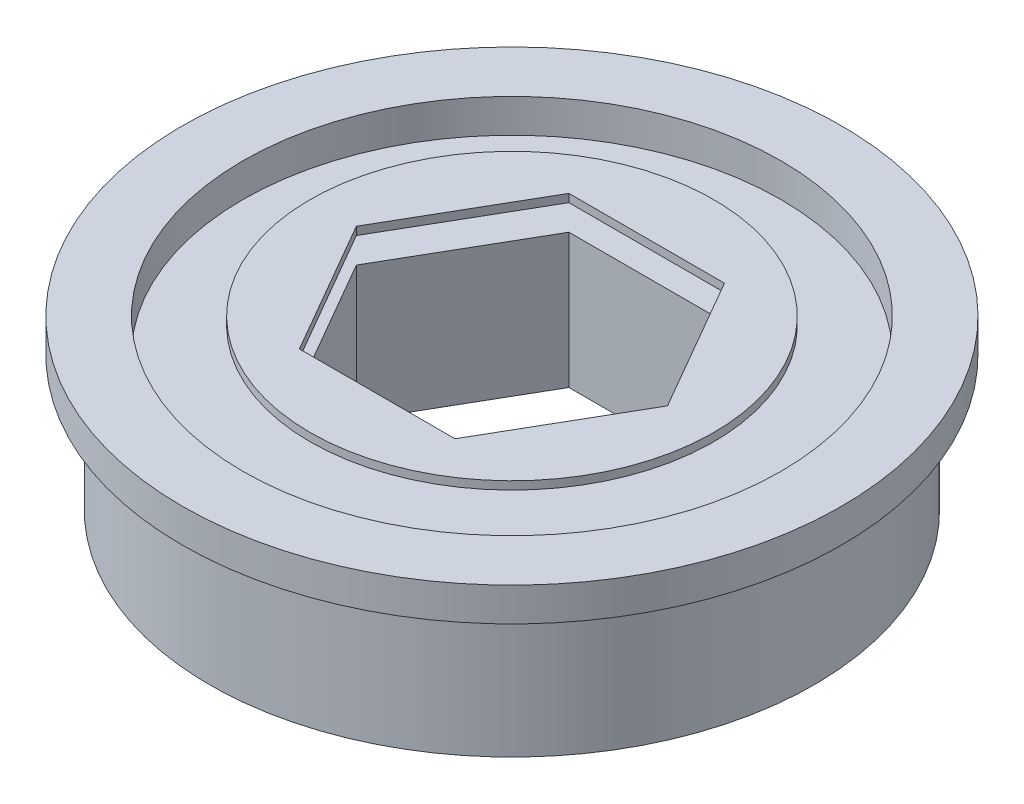
ISO-10303-21;
HEADER;
FILE_DESCRIPTION(('STEP AP214'),'2;1');
FILE_NAME('part.step','',(''),(''),'','','');
FILE_SCHEMA(('AUTOMOTIVE_DESIGN { 1 0 10303 214 1 1 1 1 }'));
ENDSEC;
DATA;
#1=APPLICATION_CONTEXT('core data for automotive mechanical design processes');
#2=APPLICATION_PROTOCOL_DEFINITION('international standard','automotive_design',2000,#1);
#3=PRODUCT_CONTEXT('',#1,'mechanical');
#4=PRODUCT('Part','Part','',(#3));
#5=PRODUCT_RELATED_PRODUCT_CATEGORY('part','',(#4));
#6=PRODUCT_DEFINITION_FORMATION('','',#4);
#7=PRODUCT_DEFINITION_CONTEXT('part definition',#1,'design');
#8=PRODUCT_DEFINITION('design','',#6,#7);
#9=PRODUCT_DEFINITION_SHAPE('','',#8);
#10=(LENGTH_UNIT() NAMED_UNIT(*) SI_UNIT(.MILLI.,.METRE.));
#11=(NAMED_UNIT(*) PLANE_ANGLE_UNIT() SI_UNIT($,.RADIAN.));
#12=(NAMED_UNIT(*) SI_UNIT($,.STERADIAN.) SOLID_ANGLE_UNIT());
#13=UNCERTAINTY_MEASURE_WITH_UNIT(LENGTH_MEASURE(1.E-05),#10,'distance_accuracy_value','');
#14=(GEOMETRIC_REPRESENTATION_CONTEXT(3) GLOBAL_UNCERTAINTY_ASSIGNED_CONTEXT((#13)) GLOBAL_UNIT_ASSIGNED_CONTEXT((#10,
#11,#12)) REPRESENTATION_CONTEXT('',''));
#15=CARTESIAN_POINT('',(0.,0.,0.));
#16=DIRECTION('',(0.,0.,1.));
#17=DIRECTION('',(1.,0.,0.));
#18=AXIS2_PLACEMENT_3D('',#15,#16,#17);
#19=CARTESIAN_POINT('',(0.,7.9375,0.));
#20=DIRECTION('',(0.,-1.,0.));
#21=DIRECTION('',(0.,0.,-1.));
#22=AXIS2_PLACEMENT_3D('',#19,#20,#21);
#23=CYLINDRICAL_SURFACE('',#22,9.525);
#24=CARTESIAN_POINT('',(0.,7.9375,0.));
#25=DIRECTION('',(0.,-1.,0.));
#26=DIRECTION('',(0.,0.,1.));
#27=AXIS2_PLACEMENT_3D('',#24,#25,#26);
#28=CIRCLE('',#27,9.525);
#29=CARTESIAN_POINT('',(0.,7.9375,9.525));
#30=VERTEX_POINT('',#29);
#31=EDGE_CURVE('E136',#30,#30,#28,.T.);
#32=ORIENTED_EDGE('',*,*,#31,.T.);
#33=EDGE_LOOP('',(#32));
#34=FACE_BOUND('',#33,.T.);
#35=CARTESIAN_POINT('',(0.,7.5565,0.));
#36=DIRECTION('',(0.,-1.,0.));
#37=DIRECTION('',(0.,0.,1.));
#38=AXIS2_PLACEMENT_3D('',#35,#36,#37);
#39=CIRCLE('',#38,9.525);
#40=CARTESIAN_POINT('',(0.,7.5565,9.525));
#41=VERTEX_POINT('',#40);
#42=EDGE_CURVE('E125',#41,#41,#39,.T.);
#43=ORIENTED_EDGE('',*,*,#42,.F.);
#44=EDGE_LOOP('',(#43));
#45=FACE_BOUND('',#44,.T.);
#46=ADVANCED_FACE('F44',(#34,#45),#23,.T.);
#47=CARTESIAN_POINT('',(0.,7.9375,0.));
#48=DIRECTION('',(0.,1.,0.));
#49=DIRECTION('',(0.,0.,1.));
#50=AXIS2_PLACEMENT_3D('',#47,#48,#49);
#51=PLANE('',#50);
#52=DIRECTION('',(-1.,0.,0.));
#53=VECTOR('',#52,1.);
#54=CARTESIAN_POINT('',(3.67194771204602,7.9375,6.36));
#55=LINE('',#54,#53);
#56=CARTESIAN_POINT('',(3.67194771204602,7.9375,6.36));
#57=VERTEX_POINT('',#56);
#58=CARTESIAN_POINT('',(-3.67194771204601,7.9375,6.36));
#59=VERTEX_POINT('',#58);
#60=EDGE_CURVE('E99',#57,#59,#55,.T.);
#61=ORIENTED_EDGE('',*,*,#60,.T.);
#62=DIRECTION('',(-0.5,0.,-0.866025403784439));
#63=VECTOR('',#62,1.);
#64=CARTESIAN_POINT('',(-3.67194771204601,7.9375,6.36));
#65=LINE('',#64,#63);
#66=CARTESIAN_POINT('',(-7.34389542409204,7.9375,0.));
#67=VERTEX_POINT('',#66);
#68=EDGE_CURVE('E106',#59,#67,#65,.T.);
#69=ORIENTED_EDGE('',*,*,#68,.T.);
#70=DIRECTION('',(0.5,0.,-0.866025403784439));
#71=VECTOR('',#70,1.);
#72=CARTESIAN_POINT('',(-7.34389542409204,7.9375,0.));
#73=LINE('',#72,#71);
#74=CARTESIAN_POINT('',(-3.67194771204602,7.9375,-6.36));
#75=VERTEX_POINT('',#74);
#76=EDGE_CURVE('E58',#67,#75,#73,.T.);
#77=ORIENTED_EDGE('',*,*,#76,.T.);
#78=DIRECTION('',(1.,0.,0.));
#79=VECTOR('',#78,1.);
#80=CARTESIAN_POINT('',(-3.67194771204602,7.9375,-6.36));
#81=LINE('',#80,#79);
#82=CARTESIAN_POINT('',(3.67194771204602,7.9375,-6.36));
#83=VERTEX_POINT('',#82);
#84=EDGE_CURVE('E117',#75,#83,#81,.T.);
#85=ORIENTED_EDGE('',*,*,#84,.T.);
#86=DIRECTION('',(0.5,0.,0.866025403784438));
#87=VECTOR('',#86,1.);
#88=CARTESIAN_POINT('',(3.67194771204602,7.9375,-6.36));
#89=LINE('',#88,#87);
#90=CARTESIAN_POINT('',(7.34389542409204,7.9375,0.));
#91=VERTEX_POINT('',#90);
#92=EDGE_CURVE('E120',#83,#91,#89,.T.);
#93=ORIENTED_EDGE('',*,*,#92,.T.);
#94=DIRECTION('',(-0.5,0.,0.866025403784439));
#95=VECTOR('',#94,1.);
#96=CARTESIAN_POINT('',(7.34389542409204,7.9375,0.));
#97=LINE('',#96,#95);
#98=EDGE_CURVE('E103',#91,#57,#97,.T.);
#99=ORIENTED_EDGE('',*,*,#98,.T.);
#100=EDGE_LOOP('',(#61,#69,#77,#85,#93,#99));
#101=FACE_BOUND('',#100,.T.);
#102=ORIENTED_EDGE('',*,*,#31,.F.);
#103=EDGE_LOOP('',(#102));
#104=FACE_BOUND('',#103,.T.);
#105=ADVANCED_FACE('F110',(#101,#104),#51,.T.);
#106=CARTESIAN_POINT('',(0.,7.5565,0.));
#107=DIRECTION('',(0.,1.,0.));
#108=DIRECTION('',(0.,0.,1.));
#109=AXIS2_PLACEMENT_3D('',#106,#107,#108);
#110=PLANE('',#109);
#111=DIRECTION('',(0.5,0.,0.866025403784439));
#112=VECTOR('',#111,1.);
#113=CARTESIAN_POINT('',(-5.50792156806903,7.5565,3.18));
#114=LINE('',#113,#112);
#115=CARTESIAN_POINT('',(-7.34389542409204,7.5565,0.));
#116=VERTEX_POINT('',#115);
#117=CARTESIAN_POINT('',(-3.67194771204601,7.5565,6.36));
#118=VERTEX_POINT('',#117);
#119=EDGE_CURVE('E139',#116,#118,#114,.T.);
#120=ORIENTED_EDGE('',*,*,#119,.T.);
#121=DIRECTION('',(1.,0.,0.));
#122=VECTOR('',#121,1.);
#123=CARTESIAN_POINT('',(0.,7.5565,6.36));
#124=LINE('',#123,#122);
#125=CARTESIAN_POINT('',(3.67194771204602,7.5565,6.36));
#126=VERTEX_POINT('',#125);
#127=EDGE_CURVE('E12',#118,#126,#124,.T.);
#128=ORIENTED_EDGE('',*,*,#127,.T.);
#129=DIRECTION('',(0.5,0.,-0.866025403784439));
#130=VECTOR('',#129,1.);
#131=CARTESIAN_POINT('',(5.50792156806903,7.5565,3.18));
#132=LINE('',#131,#130);
#133=CARTESIAN_POINT('',(7.34389542409204,7.5565,0.));
#134=VERTEX_POINT('',#133);
#135=EDGE_CURVE('E51',#126,#134,#132,.T.);
#136=ORIENTED_EDGE('',*,*,#135,.T.);
#137=DIRECTION('',(-0.5,0.,-0.866025403784439));
#138=VECTOR('',#137,1.);
#139=CARTESIAN_POINT('',(5.50792156806903,7.5565,-3.18));
#140=LINE('',#139,#138);
#141=CARTESIAN_POINT('',(3.67194771204602,7.5565,-6.36));
#142=VERTEX_POINT('',#141);
#143=EDGE_CURVE('E149',#134,#142,#140,.T.);
#144=ORIENTED_EDGE('',*,*,#143,.T.);
#145=DIRECTION('',(-1.,0.,0.));
#146=VECTOR('',#145,1.);
#147=CARTESIAN_POINT('',(0.,7.5565,-6.36));
#148=LINE('',#147,#146);
#149=CARTESIAN_POINT('',(-3.67194771204602,7.5565,-6.36));
#150=VERTEX_POINT('',#149);
#151=EDGE_CURVE('E146',#142,#150,#148,.T.);
#152=ORIENTED_EDGE('',*,*,#151,.T.);
#153=DIRECTION('',(-0.5,0.,0.866025403784439));
#154=VECTOR('',#153,1.);
#155=CARTESIAN_POINT('',(-5.50792156806903,7.5565,-3.18));
#156=LINE('',#155,#154);
#157=EDGE_CURVE('E143',#150,#116,#156,.T.);
#158=ORIENTED_EDGE('',*,*,#157,.T.);
#159=EDGE_LOOP('',(#120,#128,#136,#144,#152,#158));
#160=FACE_BOUND('',#159,.T.);
#161=ORIENTED_EDGE('',*,*,#42,.T.);
#162=EDGE_LOOP('',(#161));
#163=FACE_BOUND('',#162,.T.);
#164=ADVANCED_FACE('F153',(#160,#163),#110,.F.);
#165=CARTESIAN_POINT('',(3.67194771204602,7.9375,6.36));
#166=DIRECTION('',(0.,0.,1.));
#167=DIRECTION('',(1.,0.,0.));
#168=AXIS2_PLACEMENT_3D('',#165,#166,#167);
#169=PLANE('',#168);
#170=DIRECTION('',(0.,-1.,0.));
#171=VECTOR('',#170,1.);
#172=CARTESIAN_POINT('',(-3.67194771204601,7.9375,6.36));
#173=LINE('',#172,#171);
#174=EDGE_CURVE('E66',#59,#118,#173,.T.);
#175=ORIENTED_EDGE('',*,*,#174,.F.);
#176=ORIENTED_EDGE('',*,*,#60,.F.);
#177=DIRECTION('',(0.,-1.,0.));
#178=VECTOR('',#177,1.);
#179=CARTESIAN_POINT('',(3.67194771204602,7.9375,6.36));
#180=LINE('',#179,#178);
#181=EDGE_CURVE('E123',#57,#126,#180,.T.);
#182=ORIENTED_EDGE('',*,*,#181,.T.);
#183=ORIENTED_EDGE('',*,*,#127,.F.);
#184=EDGE_LOOP('',(#175,#176,#182,#183));
#185=FACE_BOUND('',#184,.T.);
#186=ADVANCED_FACE('F96',(#185),#169,.F.);
#187=CARTESIAN_POINT('',(7.34389542409204,7.9375,0.));
#188=DIRECTION('',(0.866025403784439,0.,0.5));
#189=DIRECTION('',(0.5,0.,-0.866025403784439));
#190=AXIS2_PLACEMENT_3D('',#187,#188,#189);
#191=PLANE('',#190);
#192=ORIENTED_EDGE('',*,*,#181,.F.);
#193=ORIENTED_EDGE('',*,*,#98,.F.);
#194=DIRECTION('',(0.,-1.,0.));
#195=VECTOR('',#194,1.);
#196=CARTESIAN_POINT('',(7.34389542409204,7.9375,0.));
#197=LINE('',#196,#195);
#198=EDGE_CURVE('E126',#91,#134,#197,.T.);
#199=ORIENTED_EDGE('',*,*,#198,.T.);
#200=ORIENTED_EDGE('',*,*,#135,.F.);
#201=EDGE_LOOP('',(#192,#193,#199,#200));
#202=FACE_BOUND('',#201,.T.);
#203=ADVANCED_FACE('F156',(#202),#191,.F.);
#204=CARTESIAN_POINT('',(3.67194771204602,7.9375,-6.36));
#205=DIRECTION('',(0.866025403784439,0.,-0.5));
#206=DIRECTION('',(-0.5,0.,-0.866025403784439));
#207=AXIS2_PLACEMENT_3D('',#204,#205,#206);
#208=PLANE('',#207);
#209=ORIENTED_EDGE('',*,*,#198,.F.);
#210=ORIENTED_EDGE('',*,*,#92,.F.);
#211=DIRECTION('',(0.,-1.,0.));
#212=VECTOR('',#211,1.);
#213=CARTESIAN_POINT('',(3.67194771204602,7.9375,-6.36));
#214=LINE('',#213,#212);
#215=EDGE_CURVE('E129',#83,#142,#214,.T.);
#216=ORIENTED_EDGE('',*,*,#215,.T.);
#217=ORIENTED_EDGE('',*,*,#143,.F.);
#218=EDGE_LOOP('',(#209,#210,#216,#217));
#219=FACE_BOUND('',#218,.T.);
#220=ADVANCED_FACE('F159',(#219),#208,.F.);
#221=CARTESIAN_POINT('',(-3.67194771204602,7.9375,-6.36));
#222=DIRECTION('',(0.,0.,-1.));
#223=DIRECTION('',(-1.,0.,0.));
#224=AXIS2_PLACEMENT_3D('',#221,#222,#223);
#225=PLANE('',#224);
#226=ORIENTED_EDGE('',*,*,#215,.F.);
#227=ORIENTED_EDGE('',*,*,#84,.F.);
#228=DIRECTION('',(0.,-1.,0.));
#229=VECTOR('',#228,1.);
#230=CARTESIAN_POINT('',(-3.67194771204602,7.9375,-6.36));
#231=LINE('',#230,#229);
#232=EDGE_CURVE('E132',#75,#150,#231,.T.);
#233=ORIENTED_EDGE('',*,*,#232,.T.);
#234=ORIENTED_EDGE('',*,*,#151,.F.);
#235=EDGE_LOOP('',(#226,#227,#233,#234));
#236=FACE_BOUND('',#235,.T.);
#237=ADVANCED_FACE('F162',(#236),#225,.F.);
#238=CARTESIAN_POINT('',(-7.34389542409204,7.9375,0.));
#239=DIRECTION('',(-0.866025403784439,0.,-0.5));
#240=DIRECTION('',(-0.5,0.,0.866025403784439));
#241=AXIS2_PLACEMENT_3D('',#238,#239,#240);
#242=PLANE('',#241);
#243=ORIENTED_EDGE('',*,*,#232,.F.);
#244=ORIENTED_EDGE('',*,*,#76,.F.);
#245=DIRECTION('',(0.,-1.,0.));
#246=VECTOR('',#245,1.);
#247=CARTESIAN_POINT('',(-7.34389542409204,7.9375,0.));
#248=LINE('',#247,#246);
#249=EDGE_CURVE('E102',#67,#116,#248,.T.);
#250=ORIENTED_EDGE('',*,*,#249,.T.);
#251=ORIENTED_EDGE('',*,*,#157,.F.);
#252=EDGE_LOOP('',(#243,#244,#250,#251));
#253=FACE_BOUND('',#252,.T.);
#254=ADVANCED_FACE('F163',(#253),#242,.F.);
#255=CARTESIAN_POINT('',(-3.67194771204601,7.9375,6.36));
#256=DIRECTION('',(-0.866025403784439,0.,0.5));
#257=DIRECTION('',(0.5,0.,0.866025403784439));
#258=AXIS2_PLACEMENT_3D('',#255,#256,#257);
#259=PLANE('',#258);
#260=ORIENTED_EDGE('',*,*,#249,.F.);
#261=ORIENTED_EDGE('',*,*,#68,.F.);
#262=ORIENTED_EDGE('',*,*,#174,.T.);
#263=ORIENTED_EDGE('',*,*,#119,.F.);
#264=EDGE_LOOP('',(#260,#261,#262,#263));
#265=FACE_BOUND('',#264,.T.);
#266=ADVANCED_FACE('F107',(#265),#259,.F.);
#267=CLOSED_SHELL('',(#46,#105,#164,#186,#203,#220,#237,#254,#266));
#268=MANIFOLD_SOLID_BREP('B2',#267);
#269=CARTESIAN_POINT('',(0.,6.35,0.));
#270=DIRECTION('',(0.,1.,0.));
#271=DIRECTION('',(0.,0.,1.));
#272=AXIS2_PLACEMENT_3D('',#269,#270,#271);
#273=CYLINDRICAL_SURFACE('',#272,15.5575);
#274=CARTESIAN_POINT('',(0.,6.35,0.));
#275=DIRECTION('',(0.,1.,0.));
#276=DIRECTION('',(0.,0.,1.));
#277=AXIS2_PLACEMENT_3D('',#274,#275,#276);
#278=CIRCLE('',#277,15.5575);
#279=CARTESIAN_POINT('',(0.,6.35,15.5575));
#280=VERTEX_POINT('',#279);
#281=EDGE_CURVE('E42',#280,#280,#278,.T.);
#282=ORIENTED_EDGE('',*,*,#281,.T.);
#283=EDGE_LOOP('',(#282));
#284=FACE_BOUND('',#283,.T.);
#285=CARTESIAN_POINT('',(0.,7.9375,0.));
#286=DIRECTION('',(0.,1.,0.));
#287=DIRECTION('',(0.,0.,1.));
#288=AXIS2_PLACEMENT_3D('',#285,#286,#287);
#289=CIRCLE('',#288,15.5575);
#290=CARTESIAN_POINT('',(0.,7.9375,15.5575));
#291=VERTEX_POINT('',#290);
#292=EDGE_CURVE('E247',#291,#291,#289,.T.);
#293=ORIENTED_EDGE('',*,*,#292,.F.);
#294=EDGE_LOOP('',(#293));
#295=FACE_BOUND('',#294,.T.);
#296=ADVANCED_FACE('F240',(#284,#295),#273,.T.);
#297=CARTESIAN_POINT('',(15.5575,6.35,0.));
#298=DIRECTION('',(0.,-1.,0.));
#299=DIRECTION('',(0.,0.,-1.));
#300=AXIS2_PLACEMENT_3D('',#297,#298,#299);
#301=PLANE('',#300);
#302=CARTESIAN_POINT('',(0.,6.35,0.));
#303=DIRECTION('',(0.,-1.,0.));
#304=DIRECTION('',(0.,0.,-1.));
#305=AXIS2_PLACEMENT_3D('',#302,#303,#304);
#306=CIRCLE('',#305,14.2748);
#307=CARTESIAN_POINT('',(0.,6.35,-14.2748));
#308=VERTEX_POINT('',#307);
#309=EDGE_CURVE('E346',#308,#308,#306,.T.);
#310=ORIENTED_EDGE('',*,*,#309,.F.);
#311=EDGE_LOOP('',(#310));
#312=FACE_BOUND('',#311,.T.);
#313=ORIENTED_EDGE('',*,*,#281,.F.);
#314=EDGE_LOOP('',(#313));
#315=FACE_BOUND('',#314,.T.);
#316=ADVANCED_FACE('F363',(#312,#315),#301,.T.);
#317=CARTESIAN_POINT('',(0.,7.9375,0.));
#318=DIRECTION('',(0.,1.,0.));
#319=DIRECTION('',(0.,0.,1.));
#320=AXIS2_PLACEMENT_3D('',#317,#318,#319);
#321=PLANE('',#320);
#322=CARTESIAN_POINT('',(0.,7.9375,0.));
#323=DIRECTION('',(0.,1.,0.));
#324=DIRECTION('',(0.,0.,1.));
#325=AXIS2_PLACEMENT_3D('',#322,#323,#324);
#326=CIRCLE('',#325,12.7);
#327=CARTESIAN_POINT('',(0.,7.9375,12.7));
#328=VERTEX_POINT('',#327);
#329=EDGE_CURVE('E350',#328,#328,#326,.T.);
#330=ORIENTED_EDGE('',*,*,#329,.F.);
#331=EDGE_LOOP('',(#330));
#332=FACE_BOUND('',#331,.T.);
#333=ORIENTED_EDGE('',*,*,#292,.T.);
#334=EDGE_LOOP('',(#333));
#335=FACE_BOUND('',#334,.T.);
#336=ADVANCED_FACE('F360',(#332,#335),#321,.T.);
#337=CARTESIAN_POINT('',(0.,7.9375,0.));
#338=DIRECTION('',(0.,1.,0.));
#339=DIRECTION('',(0.,0.,1.));
#340=AXIS2_PLACEMENT_3D('',#337,#338,#339);
#341=CYLINDRICAL_SURFACE('',#340,12.7);
#342=CARTESIAN_POINT('',(0.,6.34999999999999,0.));
#343=DIRECTION('',(0.,1.,0.));
#344=DIRECTION('',(0.,0.,1.));
#345=AXIS2_PLACEMENT_3D('',#342,#343,#344);
#346=CIRCLE('',#345,12.7);
#347=CARTESIAN_POINT('',(0.,6.34999999999999,12.7));
#348=VERTEX_POINT('',#347);
#349=EDGE_CURVE('E355',#348,#348,#346,.T.);
#350=ORIENTED_EDGE('',*,*,#349,.F.);
#351=EDGE_LOOP('',(#350));
#352=FACE_BOUND('',#351,.T.);
#353=ORIENTED_EDGE('',*,*,#329,.T.);
#354=EDGE_LOOP('',(#353));
#355=FACE_BOUND('',#354,.T.);
#356=ADVANCED_FACE('F374',(#352,#355),#341,.F.);
#357=CARTESIAN_POINT('',(0.,6.35,0.));
#358=DIRECTION('',(0.,-1.,0.));
#359=DIRECTION('',(0.,0.,-1.));
#360=AXIS2_PLACEMENT_3D('',#357,#358,#359);
#361=PLANE('',#360);
#362=DIRECTION('',(-0.5,0.,0.866025403784439));
#363=VECTOR('',#362,1.);
#364=CARTESIAN_POINT('',(5.50792156806903,6.35,3.18));
#365=LINE('',#364,#363);
#366=CARTESIAN_POINT('',(7.34389542409204,6.35,0.));
#367=VERTEX_POINT('',#366);
#368=CARTESIAN_POINT('',(3.67194771204602,6.35,6.36));
#369=VERTEX_POINT('',#368);
#370=EDGE_CURVE('E340',#367,#369,#365,.T.);
#371=ORIENTED_EDGE('',*,*,#370,.T.);
#372=DIRECTION('',(-1.,0.,0.));
#373=VECTOR('',#372,1.);
#374=CARTESIAN_POINT('',(0.,6.35,6.36));
#375=LINE('',#374,#373);
#376=CARTESIAN_POINT('',(-3.67194771204601,6.35,6.36));
#377=VERTEX_POINT('',#376);
#378=EDGE_CURVE('E343',#369,#377,#375,.T.);
#379=ORIENTED_EDGE('',*,*,#378,.T.);
#380=DIRECTION('',(-0.5,0.,-0.866025403784439));
#381=VECTOR('',#380,1.);
#382=CARTESIAN_POINT('',(-5.50792156806903,6.35,3.18));
#383=LINE('',#382,#381);
#384=CARTESIAN_POINT('',(-7.34389542409204,6.35,0.));
#385=VERTEX_POINT('',#384);
#386=EDGE_CURVE('E325',#377,#385,#383,.T.);
#387=ORIENTED_EDGE('',*,*,#386,.T.);
#388=DIRECTION('',(0.5,0.,-0.866025403784439));
#389=VECTOR('',#388,1.);
#390=CARTESIAN_POINT('',(-5.50792156806903,6.35,-3.18));
#391=LINE('',#390,#389);
#392=CARTESIAN_POINT('',(-3.67194771204602,6.35,-6.36));
#393=VERTEX_POINT('',#392);
#394=EDGE_CURVE('E298',#385,#393,#391,.T.);
#395=ORIENTED_EDGE('',*,*,#394,.T.);
#396=DIRECTION('',(1.,0.,0.));
#397=VECTOR('',#396,1.);
#398=CARTESIAN_POINT('',(0.,6.35,-6.36));
#399=LINE('',#398,#397);
#400=CARTESIAN_POINT('',(3.67194771204602,6.35,-6.36));
#401=VERTEX_POINT('',#400);
#402=EDGE_CURVE('E334',#393,#401,#399,.T.);
#403=ORIENTED_EDGE('',*,*,#402,.T.);
#404=DIRECTION('',(0.5,0.,0.866025403784439));
#405=VECTOR('',#404,1.);
#406=CARTESIAN_POINT('',(5.50792156806903,6.35,-3.18));
#407=LINE('',#406,#405);
#408=EDGE_CURVE('E337',#401,#367,#407,.T.);
#409=ORIENTED_EDGE('',*,*,#408,.T.);
#410=EDGE_LOOP('',(#371,#379,#387,#395,#403,#409));
#411=FACE_BOUND('',#410,.T.);
#412=ORIENTED_EDGE('',*,*,#349,.T.);
#413=EDGE_LOOP('',(#412));
#414=FACE_BOUND('',#413,.T.);
#415=ADVANCED_FACE('F381',(#411,#414),#361,.F.);
#416=CARTESIAN_POINT('',(0.,0.,0.));
#417=DIRECTION('',(0.,1.,0.));
#418=DIRECTION('',(0.,0.,1.));
#419=AXIS2_PLACEMENT_3D('',#416,#417,#418);
#420=CYLINDRICAL_SURFACE('',#419,14.2748);
#421=CARTESIAN_POINT('',(0.,0.,0.));
#422=DIRECTION('',(0.,-1.,0.));
#423=DIRECTION('',(0.,0.,-1.));
#424=AXIS2_PLACEMENT_3D('',#421,#422,#423);
#425=CIRCLE('',#424,14.2748);
#426=CARTESIAN_POINT('',(0.,0.,-14.2748));
#427=VERTEX_POINT('',#426);
#428=EDGE_CURVE('E347',#427,#427,#425,.T.);
#429=ORIENTED_EDGE('',*,*,#428,.F.);
#430=EDGE_LOOP('',(#429));
#431=FACE_BOUND('',#430,.T.);
#432=ORIENTED_EDGE('',*,*,#309,.T.);
#433=EDGE_LOOP('',(#432));
#434=FACE_BOUND('',#433,.T.);
#435=ADVANCED_FACE('F383',(#431,#434),#420,.T.);
#436=CARTESIAN_POINT('',(0.,0.,0.));
#437=DIRECTION('',(0.,-1.,0.));
#438=DIRECTION('',(0.,0.,-1.));
#439=AXIS2_PLACEMENT_3D('',#436,#437,#438);
#440=PLANE('',#439);
#441=DIRECTION('',(-1.,0.,0.));
#442=VECTOR('',#441,1.);
#443=CARTESIAN_POINT('',(3.67194771204602,0.,6.36));
#444=LINE('',#443,#442);
#445=CARTESIAN_POINT('',(3.67194771204602,0.,6.36));
#446=VERTEX_POINT('',#445);
#447=CARTESIAN_POINT('',(-3.67194771204601,0.,6.36));
#448=VERTEX_POINT('',#447);
#449=EDGE_CURVE('E262',#446,#448,#444,.T.);
#450=ORIENTED_EDGE('',*,*,#449,.F.);
#451=DIRECTION('',(-0.5,0.,0.866025403784439));
#452=VECTOR('',#451,1.);
#453=CARTESIAN_POINT('',(7.34389542409204,0.,0.));
#454=LINE('',#453,#452);
#455=CARTESIAN_POINT('',(7.34389542409204,0.,0.));
#456=VERTEX_POINT('',#455);
#457=EDGE_CURVE('E320',#456,#446,#454,.T.);
#458=ORIENTED_EDGE('',*,*,#457,.F.);
#459=DIRECTION('',(0.5,0.,0.866025403784438));
#460=VECTOR('',#459,1.);
#461=CARTESIAN_POINT('',(3.67194771204602,0.,-6.36));
#462=LINE('',#461,#460);
#463=CARTESIAN_POINT('',(3.67194771204602,0.,-6.36));
#464=VERTEX_POINT('',#463);
#465=EDGE_CURVE('E314',#464,#456,#462,.T.);
#466=ORIENTED_EDGE('',*,*,#465,.F.);
#467=DIRECTION('',(1.,0.,0.));
#468=VECTOR('',#467,1.);
#469=CARTESIAN_POINT('',(-3.67194771204602,0.,-6.36));
#470=LINE('',#469,#468);
#471=CARTESIAN_POINT('',(-3.67194771204602,0.,-6.36));
#472=VERTEX_POINT('',#471);
#473=EDGE_CURVE('E312',#472,#464,#470,.T.);
#474=ORIENTED_EDGE('',*,*,#473,.F.);
#475=DIRECTION('',(0.5,0.,-0.866025403784439));
#476=VECTOR('',#475,1.);
#477=CARTESIAN_POINT('',(-7.34389542409204,0.,0.));
#478=LINE('',#477,#476);
#479=CARTESIAN_POINT('',(-7.34389542409204,0.,0.));
#480=VERTEX_POINT('',#479);
#481=EDGE_CURVE('E295',#480,#472,#478,.T.);
#482=ORIENTED_EDGE('',*,*,#481,.F.);
#483=DIRECTION('',(-0.5,0.,-0.866025403784439));
#484=VECTOR('',#483,1.);
#485=CARTESIAN_POINT('',(-3.67194771204601,0.,6.36));
#486=LINE('',#485,#484);
#487=EDGE_CURVE('E304',#448,#480,#486,.T.);
#488=ORIENTED_EDGE('',*,*,#487,.F.);
#489=EDGE_LOOP('',(#450,#458,#466,#474,#482,#488));
#490=FACE_BOUND('',#489,.T.);
#491=ORIENTED_EDGE('',*,*,#428,.T.);
#492=EDGE_LOOP('',(#491));
#493=FACE_BOUND('',#492,.T.);
#494=ADVANCED_FACE('F308',(#490,#493),#440,.T.);
#495=CARTESIAN_POINT('',(3.67194771204602,7.9375,6.36));
#496=DIRECTION('',(0.,0.,1.));
#497=DIRECTION('',(1.,0.,0.));
#498=AXIS2_PLACEMENT_3D('',#495,#496,#497);
#499=PLANE('',#498);
#500=DIRECTION('',(0.,-1.,0.));
#501=VECTOR('',#500,1.);
#502=CARTESIAN_POINT('',(3.67194771204602,7.9375,6.36));
#503=LINE('',#502,#501);
#504=EDGE_CURVE('E323',#369,#446,#503,.T.);
#505=ORIENTED_EDGE('',*,*,#504,.T.);
#506=ORIENTED_EDGE('',*,*,#449,.T.);
#507=DIRECTION('',(0.,-1.,0.));
#508=VECTOR('',#507,1.);
#509=CARTESIAN_POINT('',(-3.67194771204601,7.9375,6.36));
#510=LINE('',#509,#508);
#511=EDGE_CURVE('E301',#377,#448,#510,.T.);
#512=ORIENTED_EDGE('',*,*,#511,.F.);
#513=ORIENTED_EDGE('',*,*,#378,.F.);
#514=EDGE_LOOP('',(#505,#506,#512,#513));
#515=FACE_BOUND('',#514,.T.);
#516=ADVANCED_FACE('F392',(#515),#499,.F.);
#517=CARTESIAN_POINT('',(7.34389542409204,7.9375,0.));
#518=DIRECTION('',(0.866025403784439,0.,0.5));
#519=DIRECTION('',(0.5,0.,-0.866025403784439));
#520=AXIS2_PLACEMENT_3D('',#517,#518,#519);
#521=PLANE('',#520);
#522=DIRECTION('',(0.,-1.,0.));
#523=VECTOR('',#522,1.);
#524=CARTESIAN_POINT('',(7.34389542409204,7.9375,0.));
#525=LINE('',#524,#523);
#526=EDGE_CURVE('E326',#367,#456,#525,.T.);
#527=ORIENTED_EDGE('',*,*,#526,.T.);
#528=ORIENTED_EDGE('',*,*,#457,.T.);
#529=ORIENTED_EDGE('',*,*,#504,.F.);
#530=ORIENTED_EDGE('',*,*,#370,.F.);
#531=EDGE_LOOP('',(#527,#528,#529,#530));
#532=FACE_BOUND('',#531,.T.);
#533=ADVANCED_FACE('F395',(#532),#521,.F.);
#534=CARTESIAN_POINT('',(3.67194771204602,7.9375,-6.36));
#535=DIRECTION('',(0.866025403784439,0.,-0.5));
#536=DIRECTION('',(-0.5,0.,-0.866025403784439));
#537=AXIS2_PLACEMENT_3D('',#534,#535,#536);
#538=PLANE('',#537);
#539=DIRECTION('',(0.,-1.,0.));
#540=VECTOR('',#539,1.);
#541=CARTESIAN_POINT('',(3.67194771204602,7.9375,-6.36));
#542=LINE('',#541,#540);
#543=EDGE_CURVE('E328',#401,#464,#542,.T.);
#544=ORIENTED_EDGE('',*,*,#543,.T.);
#545=ORIENTED_EDGE('',*,*,#465,.T.);
#546=ORIENTED_EDGE('',*,*,#526,.F.);
#547=ORIENTED_EDGE('',*,*,#408,.F.);
#548=EDGE_LOOP('',(#544,#545,#546,#547));
#549=FACE_BOUND('',#548,.T.);
#550=ADVANCED_FACE('F403',(#549),#538,.F.);
#551=CARTESIAN_POINT('',(-3.67194771204602,7.9375,-6.36));
#552=DIRECTION('',(0.,0.,-1.));
#553=DIRECTION('',(-1.,0.,0.));
#554=AXIS2_PLACEMENT_3D('',#551,#552,#553);
#555=PLANE('',#554);
#556=DIRECTION('',(0.,-1.,0.));
#557=VECTOR('',#556,1.);
#558=CARTESIAN_POINT('',(-3.67194771204602,7.9375,-6.36));
#559=LINE('',#558,#557);
#560=EDGE_CURVE('E300',#393,#472,#559,.T.);
#561=ORIENTED_EDGE('',*,*,#560,.T.);
#562=ORIENTED_EDGE('',*,*,#473,.T.);
#563=ORIENTED_EDGE('',*,*,#543,.F.);
#564=ORIENTED_EDGE('',*,*,#402,.F.);
#565=EDGE_LOOP('',(#561,#562,#563,#564));
#566=FACE_BOUND('',#565,.T.);
#567=ADVANCED_FACE('F400',(#566),#555,.F.);
#568=CARTESIAN_POINT('',(-7.34389542409204,7.9375,0.));
#569=DIRECTION('',(-0.866025403784439,0.,-0.5));
#570=DIRECTION('',(-0.5,0.,0.866025403784439));
#571=AXIS2_PLACEMENT_3D('',#568,#569,#570);
#572=PLANE('',#571);
#573=DIRECTION('',(0.,-1.,0.));
#574=VECTOR('',#573,1.);
#575=CARTESIAN_POINT('',(-7.34389542409204,7.9375,0.));
#576=LINE('',#575,#574);
#577=EDGE_CURVE('E254',#385,#480,#576,.T.);
#578=ORIENTED_EDGE('',*,*,#577,.T.);
#579=ORIENTED_EDGE('',*,*,#481,.T.);
#580=ORIENTED_EDGE('',*,*,#560,.F.);
#581=ORIENTED_EDGE('',*,*,#394,.F.);
#582=EDGE_LOOP('',(#578,#579,#580,#581));
#583=FACE_BOUND('',#582,.T.);
#584=ADVANCED_FACE('F292',(#583),#572,.F.);
#585=CARTESIAN_POINT('',(-3.67194771204601,7.9375,6.36));
#586=DIRECTION('',(-0.866025403784439,0.,0.5));
#587=DIRECTION('',(0.5,0.,0.866025403784439));
#588=AXIS2_PLACEMENT_3D('',#585,#586,#587);
#589=PLANE('',#588);
#590=ORIENTED_EDGE('',*,*,#511,.T.);
#591=ORIENTED_EDGE('',*,*,#487,.T.);
#592=ORIENTED_EDGE('',*,*,#577,.F.);
#593=ORIENTED_EDGE('',*,*,#386,.F.);
#594=EDGE_LOOP('',(#590,#591,#592,#593));
#595=FACE_BOUND('',#594,.T.);
#596=ADVANCED_FACE('F305',(#595),#589,.F.);
#597=CLOSED_SHELL('',(#296,#316,#336,#356,#415,#435,#494,#516,#533,#550,#567,#584,#596));
#598=MANIFOLD_SOLID_BREP('B6',#597);
#599=ADVANCED_BREP_SHAPE_REPRESENTATION('',(#18,#268,#598),#14);
#600=SHAPE_DEFINITION_REPRESENTATION(#9,#599);
ENDSEC;
END-ISO-10303-21;
